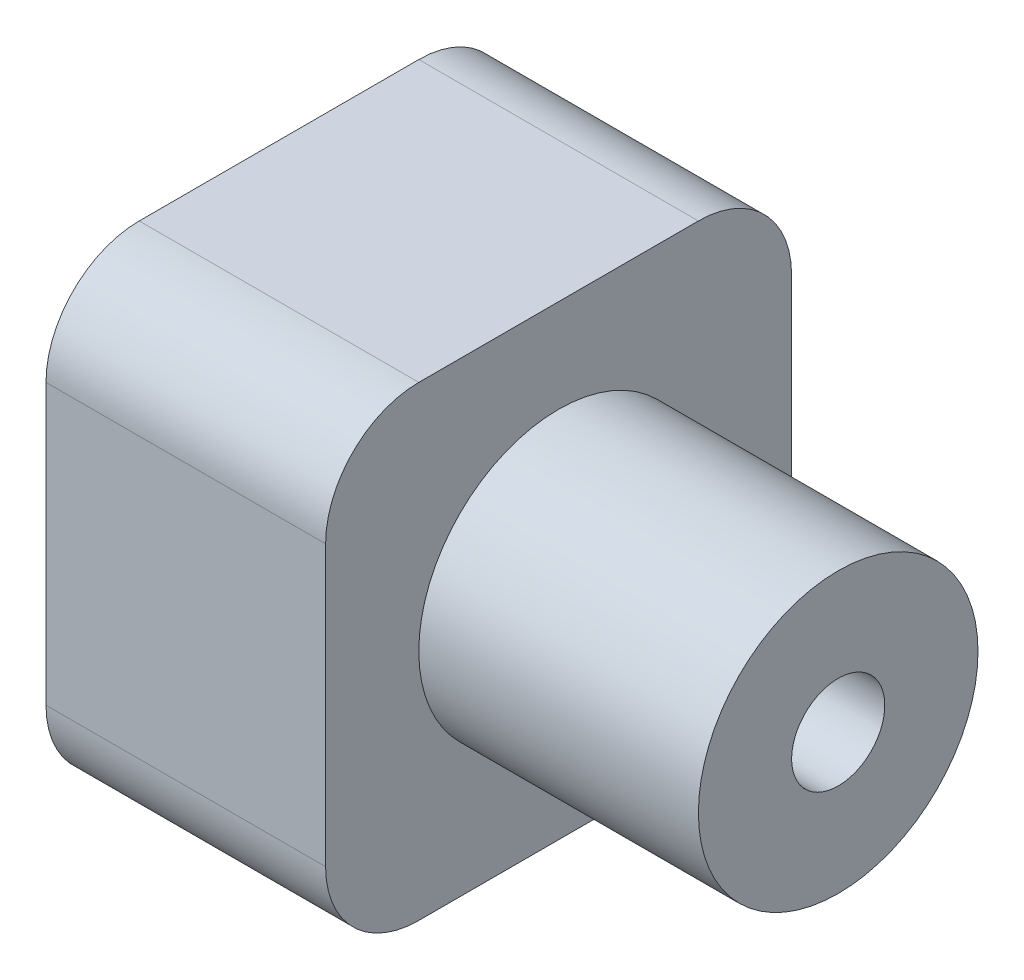
ISO-10303-21;
HEADER;
FILE_DESCRIPTION(('STEP AP214'),'2;1');
FILE_NAME('part.step','',(''),(''),'','','');
FILE_SCHEMA(('AUTOMOTIVE_DESIGN { 1 0 10303 214 1 1 1 1 }'));
ENDSEC;
DATA;
#1=APPLICATION_CONTEXT('core data for automotive mechanical design processes');
#2=APPLICATION_PROTOCOL_DEFINITION('international standard','automotive_design',2000,#1);
#3=PRODUCT_CONTEXT('',#1,'mechanical');
#4=PRODUCT('Part','Part','',(#3));
#5=PRODUCT_RELATED_PRODUCT_CATEGORY('part','',(#4));
#6=PRODUCT_DEFINITION_FORMATION('','',#4);
#7=PRODUCT_DEFINITION_CONTEXT('part definition',#1,'design');
#8=PRODUCT_DEFINITION('design','',#6,#7);
#9=PRODUCT_DEFINITION_SHAPE('','',#8);
#10=(LENGTH_UNIT() NAMED_UNIT(*) SI_UNIT(.MILLI.,.METRE.));
#11=(NAMED_UNIT(*) PLANE_ANGLE_UNIT() SI_UNIT($,.RADIAN.));
#12=(NAMED_UNIT(*) SI_UNIT($,.STERADIAN.) SOLID_ANGLE_UNIT());
#13=UNCERTAINTY_MEASURE_WITH_UNIT(LENGTH_MEASURE(1.E-05),#10,'distance_accuracy_value','');
#14=(GEOMETRIC_REPRESENTATION_CONTEXT(3) GLOBAL_UNCERTAINTY_ASSIGNED_CONTEXT((#13)) GLOBAL_UNIT_ASSIGNED_CONTEXT((#10,
#11,#12)) REPRESENTATION_CONTEXT('',''));
#15=CARTESIAN_POINT('',(0.,0.,0.));
#16=DIRECTION('',(0.,0.,1.));
#17=DIRECTION('',(1.,0.,0.));
#18=AXIS2_PLACEMENT_3D('',#15,#16,#17);
#19=CARTESIAN_POINT('',(19.05,-15.875,-15.875));
#20=DIRECTION('',(0.,0.,1.));
#21=DIRECTION('',(1.,0.,0.));
#22=AXIS2_PLACEMENT_3D('',#19,#20,#21);
#23=PLANE('',#22);
#24=DIRECTION('',(0.,1.,0.));
#25=VECTOR('',#24,1.);
#26=CARTESIAN_POINT('',(0.,-15.875,-15.875));
#27=LINE('',#26,#25);
#28=CARTESIAN_POINT('',(0.,-9.525,-15.875));
#29=VERTEX_POINT('',#28);
#30=CARTESIAN_POINT('',(0.,9.525,-15.875));
#31=VERTEX_POINT('',#30);
#32=EDGE_CURVE('E142',#29,#31,#27,.T.);
#33=ORIENTED_EDGE('',*,*,#32,.T.);
#34=DIRECTION('',(-1.,0.,0.));
#35=VECTOR('',#34,1.);
#36=CARTESIAN_POINT('',(19.05,9.525,-15.875));
#37=LINE('',#36,#35);
#38=CARTESIAN_POINT('',(19.05,9.525,-15.875));
#39=VERTEX_POINT('',#38);
#40=EDGE_CURVE('E119',#31,#39,#37,.F.);
#41=ORIENTED_EDGE('',*,*,#40,.T.);
#42=DIRECTION('',(0.,1.,0.));
#43=VECTOR('',#42,1.);
#44=CARTESIAN_POINT('',(19.05,-15.875,-15.875));
#45=LINE('',#44,#43);
#46=CARTESIAN_POINT('',(19.05,-9.525,-15.875));
#47=VERTEX_POINT('',#46);
#48=EDGE_CURVE('E154',#47,#39,#45,.T.);
#49=ORIENTED_EDGE('',*,*,#48,.F.);
#50=DIRECTION('',(-1.,0.,0.));
#51=VECTOR('',#50,1.);
#52=CARTESIAN_POINT('',(19.05,-9.525,-15.875));
#53=LINE('',#52,#51);
#54=EDGE_CURVE('E121',#47,#29,#53,.T.);
#55=ORIENTED_EDGE('',*,*,#54,.T.);
#56=EDGE_LOOP('',(#33,#41,#49,#55));
#57=FACE_BOUND('',#56,.T.);
#58=ADVANCED_FACE('F44',(#57),#23,.F.);
#59=CARTESIAN_POINT('',(19.05,15.875,15.875));
#60=DIRECTION('',(0.,-1.,0.));
#61=DIRECTION('',(0.,0.,-1.));
#62=AXIS2_PLACEMENT_3D('',#59,#60,#61);
#63=PLANE('',#62);
#64=DIRECTION('',(0.,0.,1.));
#65=VECTOR('',#64,1.);
#66=CARTESIAN_POINT('',(19.05,15.875,15.875));
#67=LINE('',#66,#65);
#68=CARTESIAN_POINT('',(19.05,15.875,-9.525));
#69=VERTEX_POINT('',#68);
#70=CARTESIAN_POINT('',(19.05,15.875,9.525));
#71=VERTEX_POINT('',#70);
#72=EDGE_CURVE('E135',#69,#71,#67,.T.);
#73=ORIENTED_EDGE('',*,*,#72,.F.);
#74=DIRECTION('',(-1.,0.,0.));
#75=VECTOR('',#74,1.);
#76=CARTESIAN_POINT('',(19.05,15.875,-9.525));
#77=LINE('',#76,#75);
#78=CARTESIAN_POINT('',(0.,15.875,-9.525));
#79=VERTEX_POINT('',#78);
#80=EDGE_CURVE('E117',#69,#79,#77,.T.);
#81=ORIENTED_EDGE('',*,*,#80,.T.);
#82=DIRECTION('',(0.,0.,1.));
#83=VECTOR('',#82,1.);
#84=CARTESIAN_POINT('',(0.,15.875,15.875));
#85=LINE('',#84,#83);
#86=CARTESIAN_POINT('',(0.,15.875,9.525));
#87=VERTEX_POINT('',#86);
#88=EDGE_CURVE('E128',#79,#87,#85,.T.);
#89=ORIENTED_EDGE('',*,*,#88,.T.);
#90=DIRECTION('',(-1.,0.,0.));
#91=VECTOR('',#90,1.);
#92=CARTESIAN_POINT('',(19.05,15.875,9.525));
#93=LINE('',#92,#91);
#94=EDGE_CURVE('E138',#87,#71,#93,.F.);
#95=ORIENTED_EDGE('',*,*,#94,.T.);
#96=EDGE_LOOP('',(#73,#81,#89,#95));
#97=FACE_BOUND('',#96,.T.);
#98=ADVANCED_FACE('F129',(#97),#63,.F.);
#99=CARTESIAN_POINT('',(19.05,-15.875,15.875));
#100=DIRECTION('',(0.,0.,-1.));
#101=DIRECTION('',(-1.,0.,0.));
#102=AXIS2_PLACEMENT_3D('',#99,#100,#101);
#103=PLANE('',#102);
#104=DIRECTION('',(0.,-1.,0.));
#105=VECTOR('',#104,1.);
#106=CARTESIAN_POINT('',(0.,-15.875,15.875));
#107=LINE('',#106,#105);
#108=CARTESIAN_POINT('',(0.,9.525,15.875));
#109=VERTEX_POINT('',#108);
#110=CARTESIAN_POINT('',(0.,-9.525,15.875));
#111=VERTEX_POINT('',#110);
#112=EDGE_CURVE('E143',#109,#111,#107,.T.);
#113=ORIENTED_EDGE('',*,*,#112,.T.);
#114=DIRECTION('',(-1.,0.,0.));
#115=VECTOR('',#114,1.);
#116=CARTESIAN_POINT('',(19.05,-9.525,15.875));
#117=LINE('',#116,#115);
#118=CARTESIAN_POINT('',(19.05,-9.525,15.875));
#119=VERTEX_POINT('',#118);
#120=EDGE_CURVE('E11',#111,#119,#117,.F.);
#121=ORIENTED_EDGE('',*,*,#120,.T.);
#122=DIRECTION('',(0.,-1.,0.));
#123=VECTOR('',#122,1.);
#124=CARTESIAN_POINT('',(19.05,-15.875,15.875));
#125=LINE('',#124,#123);
#126=CARTESIAN_POINT('',(19.05,9.525,15.875));
#127=VERTEX_POINT('',#126);
#128=EDGE_CURVE('E192',#127,#119,#125,.T.);
#129=ORIENTED_EDGE('',*,*,#128,.F.);
#130=DIRECTION('',(-1.,0.,0.));
#131=VECTOR('',#130,1.);
#132=CARTESIAN_POINT('',(19.05,9.525,15.875));
#133=LINE('',#132,#131);
#134=EDGE_CURVE('E53',#127,#109,#133,.T.);
#135=ORIENTED_EDGE('',*,*,#134,.T.);
#136=EDGE_LOOP('',(#113,#121,#129,#135));
#137=FACE_BOUND('',#136,.T.);
#138=ADVANCED_FACE('F195',(#137),#103,.F.);
#139=CARTESIAN_POINT('',(19.05,-15.875,15.875));
#140=DIRECTION('',(0.,1.,0.));
#141=DIRECTION('',(0.,0.,1.));
#142=AXIS2_PLACEMENT_3D('',#139,#140,#141);
#143=PLANE('',#142);
#144=DIRECTION('',(0.,0.,-1.));
#145=VECTOR('',#144,1.);
#146=CARTESIAN_POINT('',(0.,-15.875,15.875));
#147=LINE('',#146,#145);
#148=CARTESIAN_POINT('',(0.,-15.875,9.525));
#149=VERTEX_POINT('',#148);
#150=CARTESIAN_POINT('',(0.,-15.875,-9.525));
#151=VERTEX_POINT('',#150);
#152=EDGE_CURVE('E150',#149,#151,#147,.T.);
#153=ORIENTED_EDGE('',*,*,#152,.T.);
#154=DIRECTION('',(-1.,0.,0.));
#155=VECTOR('',#154,1.);
#156=CARTESIAN_POINT('',(19.05,-15.875,-9.525));
#157=LINE('',#156,#155);
#158=CARTESIAN_POINT('',(19.05,-15.875,-9.525));
#159=VERTEX_POINT('',#158);
#160=EDGE_CURVE('E62',#151,#159,#157,.F.);
#161=ORIENTED_EDGE('',*,*,#160,.T.);
#162=DIRECTION('',(0.,0.,-1.));
#163=VECTOR('',#162,1.);
#164=CARTESIAN_POINT('',(19.05,-15.875,15.875));
#165=LINE('',#164,#163);
#166=CARTESIAN_POINT('',(19.05,-15.875,9.525));
#167=VERTEX_POINT('',#166);
#168=EDGE_CURVE('E205',#167,#159,#165,.T.);
#169=ORIENTED_EDGE('',*,*,#168,.F.);
#170=DIRECTION('',(-1.,0.,0.));
#171=VECTOR('',#170,1.);
#172=CARTESIAN_POINT('',(19.05,-15.875,9.525));
#173=LINE('',#172,#171);
#174=EDGE_CURVE('E185',#167,#149,#173,.T.);
#175=ORIENTED_EDGE('',*,*,#174,.T.);
#176=EDGE_LOOP('',(#153,#161,#169,#175));
#177=FACE_BOUND('',#176,.T.);
#178=ADVANCED_FACE('F203',(#177),#143,.F.);
#179=CARTESIAN_POINT('',(19.05,0.,0.));
#180=DIRECTION('',(-1.,0.,0.));
#181=DIRECTION('',(0.,0.,1.));
#182=AXIS2_PLACEMENT_3D('',#179,#180,#181);
#183=PLANE('',#182);
#184=CARTESIAN_POINT('',(19.05,0.,0.));
#185=DIRECTION('',(1.,0.,0.));
#186=DIRECTION('',(0.,0.,-1.));
#187=AXIS2_PLACEMENT_3D('',#184,#185,#186);
#188=CIRCLE('',#187,9.525);
#189=CARTESIAN_POINT('',(19.05,0.,9.525));
#190=VERTEX_POINT('',#189);
#191=EDGE_CURVE('E160',#190,#190,#188,.T.);
#192=ORIENTED_EDGE('',*,*,#191,.F.);
#193=EDGE_LOOP('',(#192));
#194=FACE_BOUND('',#193,.T.);
#195=ORIENTED_EDGE('',*,*,#48,.T.);
#196=CARTESIAN_POINT('',(19.05,9.525,-9.525));
#197=DIRECTION('',(-1.,0.,0.));
#198=DIRECTION('',(0.,0.,1.));
#199=AXIS2_PLACEMENT_3D('',#196,#197,#198);
#200=CIRCLE('',#199,6.35);
#201=EDGE_CURVE('E177',#39,#69,#200,.F.);
#202=ORIENTED_EDGE('',*,*,#201,.T.);
#203=ORIENTED_EDGE('',*,*,#72,.T.);
#204=CARTESIAN_POINT('',(19.05,9.525,9.525));
#205=DIRECTION('',(-1.,0.,0.));
#206=DIRECTION('',(0.,0.,1.));
#207=AXIS2_PLACEMENT_3D('',#204,#205,#206);
#208=CIRCLE('',#207,6.35);
#209=EDGE_CURVE('E172',#71,#127,#208,.F.);
#210=ORIENTED_EDGE('',*,*,#209,.T.);
#211=ORIENTED_EDGE('',*,*,#128,.T.);
#212=CARTESIAN_POINT('',(19.05,-9.525,9.525));
#213=DIRECTION('',(-1.,0.,0.));
#214=DIRECTION('',(0.,0.,1.));
#215=AXIS2_PLACEMENT_3D('',#212,#213,#214);
#216=CIRCLE('',#215,6.35);
#217=EDGE_CURVE('E66',#119,#167,#216,.F.);
#218=ORIENTED_EDGE('',*,*,#217,.T.);
#219=ORIENTED_EDGE('',*,*,#168,.T.);
#220=CARTESIAN_POINT('',(19.05,-9.525,-9.525));
#221=DIRECTION('',(-1.,0.,0.));
#222=DIRECTION('',(0.,0.,1.));
#223=AXIS2_PLACEMENT_3D('',#220,#221,#222);
#224=CIRCLE('',#223,6.35);
#225=EDGE_CURVE('E178',#159,#47,#224,.F.);
#226=ORIENTED_EDGE('',*,*,#225,.T.);
#227=EDGE_LOOP('',(#195,#202,#203,#210,#211,#218,#219,#226));
#228=FACE_BOUND('',#227,.T.);
#229=ADVANCED_FACE('F244',(#194,#228),#183,.F.);
#230=CARTESIAN_POINT('',(0.,0.,0.));
#231=DIRECTION('',(-1.,0.,0.));
#232=DIRECTION('',(0.,0.,1.));
#233=AXIS2_PLACEMENT_3D('',#230,#231,#232);
#234=PLANE('',#233);
#235=ORIENTED_EDGE('',*,*,#88,.F.);
#236=CARTESIAN_POINT('',(0.,9.525,-9.525));
#237=DIRECTION('',(-1.,0.,0.));
#238=DIRECTION('',(0.,0.,1.));
#239=AXIS2_PLACEMENT_3D('',#236,#237,#238);
#240=CIRCLE('',#239,6.35);
#241=EDGE_CURVE('E115',#79,#31,#240,.T.);
#242=ORIENTED_EDGE('',*,*,#241,.T.);
#243=ORIENTED_EDGE('',*,*,#32,.F.);
#244=CARTESIAN_POINT('',(0.,-9.525,-9.525));
#245=DIRECTION('',(-1.,0.,0.));
#246=DIRECTION('',(0.,0.,1.));
#247=AXIS2_PLACEMENT_3D('',#244,#245,#246);
#248=CIRCLE('',#247,6.35);
#249=EDGE_CURVE('E122',#29,#151,#248,.T.);
#250=ORIENTED_EDGE('',*,*,#249,.T.);
#251=ORIENTED_EDGE('',*,*,#152,.F.);
#252=CARTESIAN_POINT('',(0.,-9.525,9.525));
#253=DIRECTION('',(-1.,0.,0.));
#254=DIRECTION('',(0.,0.,1.));
#255=AXIS2_PLACEMENT_3D('',#252,#253,#254);
#256=CIRCLE('',#255,6.35);
#257=EDGE_CURVE('E161',#149,#111,#256,.T.);
#258=ORIENTED_EDGE('',*,*,#257,.T.);
#259=ORIENTED_EDGE('',*,*,#112,.F.);
#260=CARTESIAN_POINT('',(0.,9.525,9.525));
#261=DIRECTION('',(-1.,0.,0.));
#262=DIRECTION('',(0.,0.,1.));
#263=AXIS2_PLACEMENT_3D('',#260,#261,#262);
#264=CIRCLE('',#263,6.35);
#265=EDGE_CURVE('E133',#109,#87,#264,.T.);
#266=ORIENTED_EDGE('',*,*,#265,.T.);
#267=EDGE_LOOP('',(#235,#242,#243,#250,#251,#258,#259,#266));
#268=FACE_BOUND('',#267,.T.);
#269=ADVANCED_FACE('F136',(#268),#234,.T.);
#270=CARTESIAN_POINT('',(38.1,0.,0.));
#271=DIRECTION('',(1.,0.,0.));
#272=DIRECTION('',(0.,0.,-1.));
#273=AXIS2_PLACEMENT_3D('',#270,#271,#272);
#274=PLANE('',#273);
#275=CARTESIAN_POINT('',(38.1,0.,0.));
#276=DIRECTION('',(1.,0.,0.));
#277=DIRECTION('',(0.,0.,-1.));
#278=AXIS2_PLACEMENT_3D('',#275,#276,#277);
#279=CIRCLE('',#278,9.525);
#280=CARTESIAN_POINT('',(38.1,0.,9.525));
#281=VERTEX_POINT('',#280);
#282=EDGE_CURVE('E149',#281,#281,#279,.T.);
#283=ORIENTED_EDGE('',*,*,#282,.T.);
#284=EDGE_LOOP('',(#283));
#285=FACE_BOUND('',#284,.T.);
#286=CARTESIAN_POINT('',(38.1,0.,0.));
#287=DIRECTION('',(1.,0.,0.));
#288=DIRECTION('',(0.,0.,-1.));
#289=AXIS2_PLACEMENT_3D('',#286,#287,#288);
#290=CIRCLE('',#289,3.175);
#291=CARTESIAN_POINT('',(38.1,0.,3.175));
#292=VERTEX_POINT('',#291);
#293=EDGE_CURVE('E218',#292,#292,#290,.T.);
#294=ORIENTED_EDGE('',*,*,#293,.F.);
#295=EDGE_LOOP('',(#294));
#296=FACE_BOUND('',#295,.T.);
#297=ADVANCED_FACE('F233',(#285,#296),#274,.T.);
#298=CARTESIAN_POINT('',(38.1,0.,0.));
#299=DIRECTION('',(-1.,0.,0.));
#300=DIRECTION('',(0.,0.,1.));
#301=AXIS2_PLACEMENT_3D('',#298,#299,#300);
#302=CYLINDRICAL_SURFACE('',#301,9.525);
#303=CARTESIAN_POINT('',(38.1,0.,9.525));
#304=CARTESIAN_POINT('',(37.9015625,0.,9.525));
#305=CARTESIAN_POINT('',(37.703125,0.,9.525));
#306=CARTESIAN_POINT('',(37.30625,0.,9.525));
#307=CARTESIAN_POINT('',(37.1078125,0.,9.525));
#308=CARTESIAN_POINT('',(36.7109375,0.,9.525));
#309=CARTESIAN_POINT('',(36.5125,0.,9.525));
#310=CARTESIAN_POINT('',(36.115625,0.,9.525));
#311=CARTESIAN_POINT('',(35.9171875,0.,9.525));
#312=CARTESIAN_POINT('',(35.5203125,0.,9.525));
#313=CARTESIAN_POINT('',(35.321875,0.,9.525));
#314=CARTESIAN_POINT('',(34.925,0.,9.525));
#315=CARTESIAN_POINT('',(34.7265625,0.,9.525));
#316=CARTESIAN_POINT('',(34.3296875,0.,9.525));
#317=CARTESIAN_POINT('',(34.13125,0.,9.525));
#318=CARTESIAN_POINT('',(33.734375,0.,9.525));
#319=CARTESIAN_POINT('',(33.5359375,0.,9.525));
#320=CARTESIAN_POINT('',(33.1390625,0.,9.525));
#321=CARTESIAN_POINT('',(32.940625,0.,9.525));
#322=CARTESIAN_POINT('',(32.54375,0.,9.525));
#323=CARTESIAN_POINT('',(32.3453125,0.,9.525));
#324=CARTESIAN_POINT('',(31.9484375,0.,9.525));
#325=CARTESIAN_POINT('',(31.75,0.,9.525));
#326=CARTESIAN_POINT('',(31.353125,0.,9.525));
#327=CARTESIAN_POINT('',(31.1546875,0.,9.525));
#328=CARTESIAN_POINT('',(30.7578125,0.,9.525));
#329=CARTESIAN_POINT('',(30.559375,0.,9.525));
#330=CARTESIAN_POINT('',(30.1625,0.,9.525));
#331=CARTESIAN_POINT('',(29.9640625,0.,9.525));
#332=CARTESIAN_POINT('',(29.5671875,0.,9.525));
#333=CARTESIAN_POINT('',(29.36875,0.,9.525));
#334=CARTESIAN_POINT('',(28.971875,0.,9.525));
#335=CARTESIAN_POINT('',(28.7734375,0.,9.525));
#336=CARTESIAN_POINT('',(28.3765625,0.,9.525));
#337=CARTESIAN_POINT('',(28.178125,0.,9.525));
#338=CARTESIAN_POINT('',(27.78125,0.,9.525));
#339=CARTESIAN_POINT('',(27.5828125,0.,9.525));
#340=CARTESIAN_POINT('',(27.1859375,0.,9.525));
#341=CARTESIAN_POINT('',(26.9875,0.,9.525));
#342=CARTESIAN_POINT('',(26.590625,0.,9.525));
#343=CARTESIAN_POINT('',(26.3921875,0.,9.525));
#344=CARTESIAN_POINT('',(25.9953125,0.,9.525));
#345=CARTESIAN_POINT('',(25.796875,0.,9.525));
#346=CARTESIAN_POINT('',(25.4,0.,9.525));
#347=CARTESIAN_POINT('',(25.2015625,0.,9.525));
#348=CARTESIAN_POINT('',(24.8046875,0.,9.525));
#349=CARTESIAN_POINT('',(24.60625,0.,9.525));
#350=CARTESIAN_POINT('',(24.209375,0.,9.525));
#351=CARTESIAN_POINT('',(24.0109375,0.,9.525));
#352=CARTESIAN_POINT('',(23.6140625,0.,9.525));
#353=CARTESIAN_POINT('',(23.415625,0.,9.525));
#354=CARTESIAN_POINT('',(23.01875,0.,9.525));
#355=CARTESIAN_POINT('',(22.8203125,0.,9.525));
#356=CARTESIAN_POINT('',(22.4234375,0.,9.525));
#357=CARTESIAN_POINT('',(22.225,0.,9.525));
#358=CARTESIAN_POINT('',(21.828125,0.,9.525));
#359=CARTESIAN_POINT('',(21.6296875,0.,9.525));
#360=CARTESIAN_POINT('',(21.2328125,0.,9.525));
#361=CARTESIAN_POINT('',(21.034375,0.,9.525));
#362=CARTESIAN_POINT('',(20.6375,0.,9.525));
#363=CARTESIAN_POINT('',(20.4390625,0.,9.525));
#364=CARTESIAN_POINT('',(20.0421875,0.,9.525));
#365=CARTESIAN_POINT('',(19.84375,0.,9.525));
#366=CARTESIAN_POINT('',(19.446875,0.,9.525));
#367=CARTESIAN_POINT('',(19.2484375,0.,9.525));
#368=CARTESIAN_POINT('',(19.05,0.,9.525));
#369=B_SPLINE_CURVE_WITH_KNOTS('',3,(#303,#304,#305,#306,#307,#308,#309,#310,#311,#312,#313,
#314,#315,#316,#317,#318,#319,#320,#321,#322,#323,#324,#325,#326,#327,#328,#329,#330,#331,#332,
#333,#334,#335,#336,#337,#338,#339,#340,#341,#342,#343,#344,#345,#346,#347,#348,#349,#350,#351,
#352,#353,#354,#355,#356,#357,#358,#359,#360,#361,#362,#363,#364,#365,#366,#367,#368),
.UNSPECIFIED.,.F.,.F.,(4,2,2,2,2,2,2,2,2,2,2,2,2,2,2,2,2,2,2,2,2,2,2,2,2,2,2,2,2,2,2,2,4),(0.,
0.5953125,1.190625,1.7859375,2.38125,2.9765625,3.571875,4.1671875,4.7625,5.3578125,5.953125,
6.5484375,7.14375,7.7390625,8.334375,8.9296875,9.525,10.1203125,10.715625,11.3109375,11.90625,
12.5015625,13.096875,13.6921875,14.2875,14.8828125,15.478125,16.0734375,16.66875,17.2640625,
17.859375,18.4546875,19.05),.UNSPECIFIED.);
#370=EDGE_CURVE('BSEAM231',#281,#190,#369,.T.);
#371=ORIENTED_EDGE('',*,*,#282,.F.);
#372=ORIENTED_EDGE('',*,*,#191,.T.);
#373=ORIENTED_EDGE('',*,*,#370,.T.);
#374=ORIENTED_EDGE('',*,*,#370,.F.);
#375=EDGE_LOOP('',(#371,#373,#372,#374));
#376=FACE_BOUND('',#375,.T.);
#377=ADVANCED_FACE('F231',(#376),#302,.T.);
#378=CARTESIAN_POINT('',(38.1,0.,0.));
#379=DIRECTION('',(-1.,0.,0.));
#380=DIRECTION('',(0.,0.,1.));
#381=AXIS2_PLACEMENT_3D('',#378,#379,#380);
#382=CYLINDRICAL_SURFACE('',#381,3.175);
#383=CARTESIAN_POINT('',(19.05,0.,0.));
#384=DIRECTION('',(1.,0.,0.));
#385=DIRECTION('',(0.,0.,-1.));
#386=AXIS2_PLACEMENT_3D('',#383,#384,#385);
#387=CIRCLE('',#386,3.175);
#388=CARTESIAN_POINT('',(19.05,0.,3.175));
#389=VERTEX_POINT('',#388);
#390=EDGE_CURVE('E219',#389,#389,#387,.T.);
#391=CARTESIAN_POINT('',(38.1,0.,3.175));
#392=CARTESIAN_POINT('',(37.9015625,0.,3.175));
#393=CARTESIAN_POINT('',(37.703125,0.,3.175));
#394=CARTESIAN_POINT('',(37.30625,0.,3.175));
#395=CARTESIAN_POINT('',(37.1078125,0.,3.175));
#396=CARTESIAN_POINT('',(36.7109375,0.,3.175));
#397=CARTESIAN_POINT('',(36.5125,0.,3.175));
#398=CARTESIAN_POINT('',(36.115625,0.,3.175));
#399=CARTESIAN_POINT('',(35.9171875,0.,3.175));
#400=CARTESIAN_POINT('',(35.5203125,0.,3.175));
#401=CARTESIAN_POINT('',(35.321875,0.,3.175));
#402=CARTESIAN_POINT('',(34.925,0.,3.175));
#403=CARTESIAN_POINT('',(34.7265625,0.,3.175));
#404=CARTESIAN_POINT('',(34.3296875,0.,3.175));
#405=CARTESIAN_POINT('',(34.13125,0.,3.175));
#406=CARTESIAN_POINT('',(33.734375,0.,3.175));
#407=CARTESIAN_POINT('',(33.5359375,0.,3.175));
#408=CARTESIAN_POINT('',(33.1390625,0.,3.175));
#409=CARTESIAN_POINT('',(32.940625,0.,3.175));
#410=CARTESIAN_POINT('',(32.54375,0.,3.175));
#411=CARTESIAN_POINT('',(32.3453125,0.,3.175));
#412=CARTESIAN_POINT('',(31.9484375,0.,3.175));
#413=CARTESIAN_POINT('',(31.75,0.,3.175));
#414=CARTESIAN_POINT('',(31.353125,0.,3.175));
#415=CARTESIAN_POINT('',(31.1546875,0.,3.175));
#416=CARTESIAN_POINT('',(30.7578125,0.,3.175));
#417=CARTESIAN_POINT('',(30.559375,0.,3.175));
#418=CARTESIAN_POINT('',(30.1625,0.,3.175));
#419=CARTESIAN_POINT('',(29.9640625,0.,3.175));
#420=CARTESIAN_POINT('',(29.5671875,0.,3.175));
#421=CARTESIAN_POINT('',(29.36875,0.,3.175));
#422=CARTESIAN_POINT('',(28.971875,0.,3.175));
#423=CARTESIAN_POINT('',(28.7734375,0.,3.175));
#424=CARTESIAN_POINT('',(28.3765625,0.,3.175));
#425=CARTESIAN_POINT('',(28.178125,0.,3.175));
#426=CARTESIAN_POINT('',(27.78125,0.,3.175));
#427=CARTESIAN_POINT('',(27.5828125,0.,3.175));
#428=CARTESIAN_POINT('',(27.1859375,0.,3.175));
#429=CARTESIAN_POINT('',(26.9875,0.,3.175));
#430=CARTESIAN_POINT('',(26.590625,0.,3.175));
#431=CARTESIAN_POINT('',(26.3921875,0.,3.175));
#432=CARTESIAN_POINT('',(25.9953125,0.,3.175));
#433=CARTESIAN_POINT('',(25.796875,0.,3.175));
#434=CARTESIAN_POINT('',(25.4,0.,3.175));
#435=CARTESIAN_POINT('',(25.2015625,0.,3.175));
#436=CARTESIAN_POINT('',(24.8046875,0.,3.175));
#437=CARTESIAN_POINT('',(24.60625,0.,3.175));
#438=CARTESIAN_POINT('',(24.209375,0.,3.175));
#439=CARTESIAN_POINT('',(24.0109375,0.,3.175));
#440=CARTESIAN_POINT('',(23.6140625,0.,3.175));
#441=CARTESIAN_POINT('',(23.415625,0.,3.175));
#442=CARTESIAN_POINT('',(23.01875,0.,3.175));
#443=CARTESIAN_POINT('',(22.8203125,0.,3.175));
#444=CARTESIAN_POINT('',(22.4234375,0.,3.175));
#445=CARTESIAN_POINT('',(22.225,0.,3.175));
#446=CARTESIAN_POINT('',(21.828125,0.,3.175));
#447=CARTESIAN_POINT('',(21.6296875,0.,3.175));
#448=CARTESIAN_POINT('',(21.2328125,0.,3.175));
#449=CARTESIAN_POINT('',(21.034375,0.,3.175));
#450=CARTESIAN_POINT('',(20.6375,0.,3.175));
#451=CARTESIAN_POINT('',(20.4390625,0.,3.175));
#452=CARTESIAN_POINT('',(20.0421875,0.,3.175));
#453=CARTESIAN_POINT('',(19.84375,0.,3.175));
#454=CARTESIAN_POINT('',(19.446875,0.,3.175));
#455=CARTESIAN_POINT('',(19.2484375,0.,3.175));
#456=CARTESIAN_POINT('',(19.05,0.,3.175));
#457=B_SPLINE_CURVE_WITH_KNOTS('',3,(#391,#392,#393,#394,#395,#396,#397,#398,#399,#400,#401,
#402,#403,#404,#405,#406,#407,#408,#409,#410,#411,#412,#413,#414,#415,#416,#417,#418,#419,#420,
#421,#422,#423,#424,#425,#426,#427,#428,#429,#430,#431,#432,#433,#434,#435,#436,#437,#438,#439,
#440,#441,#442,#443,#444,#445,#446,#447,#448,#449,#450,#451,#452,#453,#454,#455,#456),
.UNSPECIFIED.,.F.,.F.,(4,2,2,2,2,2,2,2,2,2,2,2,2,2,2,2,2,2,2,2,2,2,2,2,2,2,2,2,2,2,2,2,4),(0.,
0.595312499999993,1.19062499999999,1.78593749999999,2.38124999999999,2.97656249999999,3.571875,
4.1671875,4.7625,5.3578125,5.953125,6.5484375,7.14375,7.7390625,8.33437499999999,
8.92968749999999,9.525,10.1203125,10.715625,11.3109375,11.90625,12.5015625,13.096875,13.6921875,
14.2875,14.8828125,15.478125,16.0734375,16.66875,17.2640625,17.859375,18.4546875,19.05),.UNSPECIFIED.);
#458=EDGE_CURVE('BSEAM230',#292,#389,#457,.T.);
#459=ORIENTED_EDGE('',*,*,#293,.T.);
#460=ORIENTED_EDGE('',*,*,#390,.F.);
#461=ORIENTED_EDGE('',*,*,#458,.T.);
#462=ORIENTED_EDGE('',*,*,#458,.F.);
#463=EDGE_LOOP('',(#459,#461,#460,#462));
#464=FACE_BOUND('',#463,.T.);
#465=ADVANCED_FACE('F230',(#464),#382,.F.);
#466=ORIENTED_EDGE('',*,*,#390,.T.);
#467=EDGE_LOOP('',(#466));
#468=FACE_BOUND('',#467,.T.);
#469=ADVANCED_FACE('F256',(#468),#183,.F.);
#470=CARTESIAN_POINT('',(19.05,9.525,-9.525));
#471=DIRECTION('',(-1.,0.,0.));
#472=DIRECTION('',(0.,0.,1.));
#473=AXIS2_PLACEMENT_3D('',#470,#471,#472);
#474=CYLINDRICAL_SURFACE('',#473,6.35);
#475=ORIENTED_EDGE('',*,*,#201,.F.);
#476=ORIENTED_EDGE('',*,*,#40,.F.);
#477=ORIENTED_EDGE('',*,*,#241,.F.);
#478=ORIENTED_EDGE('',*,*,#80,.F.);
#479=EDGE_LOOP('',(#475,#476,#477,#478));
#480=FACE_BOUND('',#479,.T.);
#481=ADVANCED_FACE('F113',(#480),#474,.T.);
#482=CARTESIAN_POINT('',(19.05,-9.525,-9.525));
#483=DIRECTION('',(-1.,0.,0.));
#484=DIRECTION('',(0.,0.,1.));
#485=AXIS2_PLACEMENT_3D('',#482,#483,#484);
#486=CYLINDRICAL_SURFACE('',#485,6.35);
#487=ORIENTED_EDGE('',*,*,#225,.F.);
#488=ORIENTED_EDGE('',*,*,#160,.F.);
#489=ORIENTED_EDGE('',*,*,#249,.F.);
#490=ORIENTED_EDGE('',*,*,#54,.F.);
#491=EDGE_LOOP('',(#487,#488,#489,#490));
#492=FACE_BOUND('',#491,.T.);
#493=ADVANCED_FACE('F260',(#492),#486,.T.);
#494=CARTESIAN_POINT('',(19.05,-9.525,9.525));
#495=DIRECTION('',(-1.,0.,0.));
#496=DIRECTION('',(0.,0.,1.));
#497=AXIS2_PLACEMENT_3D('',#494,#495,#496);
#498=CYLINDRICAL_SURFACE('',#497,6.35);
#499=ORIENTED_EDGE('',*,*,#217,.F.);
#500=ORIENTED_EDGE('',*,*,#120,.F.);
#501=ORIENTED_EDGE('',*,*,#257,.F.);
#502=ORIENTED_EDGE('',*,*,#174,.F.);
#503=EDGE_LOOP('',(#499,#500,#501,#502));
#504=FACE_BOUND('',#503,.T.);
#505=ADVANCED_FACE('F199',(#504),#498,.T.);
#506=CARTESIAN_POINT('',(19.05,9.525,9.525));
#507=DIRECTION('',(-1.,0.,0.));
#508=DIRECTION('',(0.,0.,1.));
#509=AXIS2_PLACEMENT_3D('',#506,#507,#508);
#510=CYLINDRICAL_SURFACE('',#509,6.35);
#511=ORIENTED_EDGE('',*,*,#209,.F.);
#512=ORIENTED_EDGE('',*,*,#94,.F.);
#513=ORIENTED_EDGE('',*,*,#265,.F.);
#514=ORIENTED_EDGE('',*,*,#134,.F.);
#515=EDGE_LOOP('',(#511,#512,#513,#514));
#516=FACE_BOUND('',#515,.T.);
#517=ADVANCED_FACE('F50',(#516),#510,.T.);
#518=CLOSED_SHELL('',(#58,#98,#138,#178,#229,#269,#297,#377,#465,#469,#481,#493,#505,#517));
#519=MANIFOLD_SOLID_BREP('B2',#518);
#520=ADVANCED_BREP_SHAPE_REPRESENTATION('',(#18,#519),#14);
#521=SHAPE_DEFINITION_REPRESENTATION(#9,#520);
ENDSEC;
END-ISO-10303-21;
